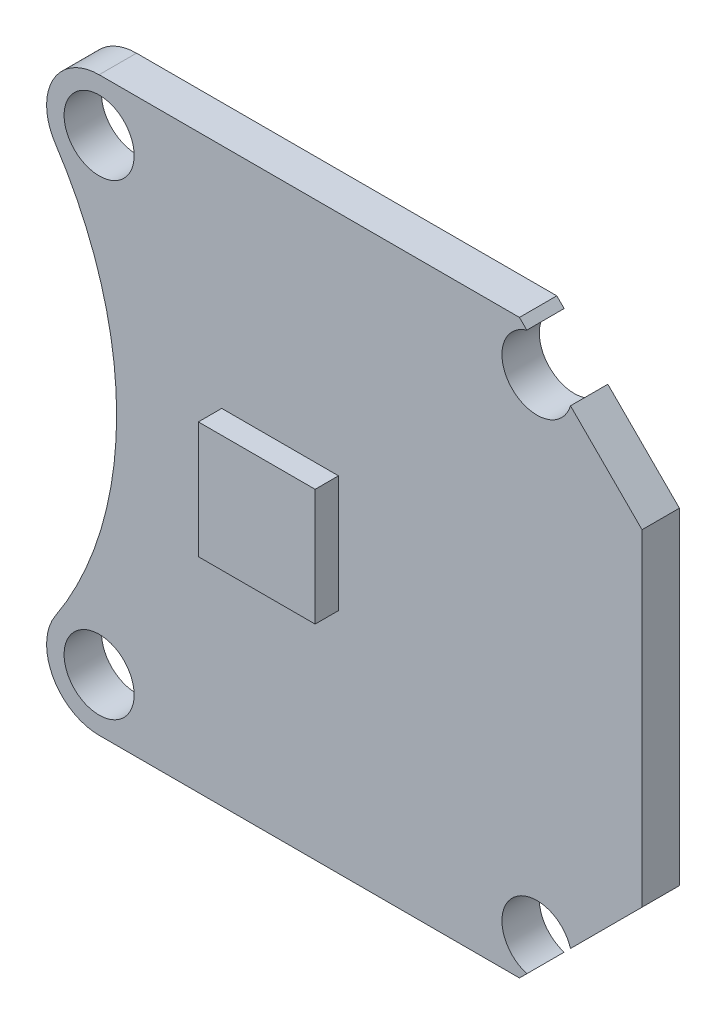
ISO-10303-21;
HEADER;
FILE_DESCRIPTION(('STEP AP214'),'2;1');
FILE_NAME('part.step','',(''),(''),'','','');
FILE_SCHEMA(('AUTOMOTIVE_DESIGN { 1 0 10303 214 1 1 1 1 }'));
ENDSEC;
DATA;
#1=APPLICATION_CONTEXT('core data for automotive mechanical design processes');
#2=APPLICATION_PROTOCOL_DEFINITION('international standard','automotive_design',2000,#1);
#3=PRODUCT_CONTEXT('',#1,'mechanical');
#4=PRODUCT('Part','Part','',(#3));
#5=PRODUCT_RELATED_PRODUCT_CATEGORY('part','',(#4));
#6=PRODUCT_DEFINITION_FORMATION('','',#4);
#7=PRODUCT_DEFINITION_CONTEXT('part definition',#1,'design');
#8=PRODUCT_DEFINITION('design','',#6,#7);
#9=PRODUCT_DEFINITION_SHAPE('','',#8);
#10=(LENGTH_UNIT() NAMED_UNIT(*) SI_UNIT(.MILLI.,.METRE.));
#11=(NAMED_UNIT(*) PLANE_ANGLE_UNIT() SI_UNIT($,.RADIAN.));
#12=(NAMED_UNIT(*) SI_UNIT($,.STERADIAN.) SOLID_ANGLE_UNIT());
#13=UNCERTAINTY_MEASURE_WITH_UNIT(LENGTH_MEASURE(1.E-05),#10,'distance_accuracy_value','');
#14=(GEOMETRIC_REPRESENTATION_CONTEXT(3) GLOBAL_UNCERTAINTY_ASSIGNED_CONTEXT((#13)) GLOBAL_UNIT_ASSIGNED_CONTEXT((#10,
#11,#12)) REPRESENTATION_CONTEXT('',''));
#15=CARTESIAN_POINT('',(0.,0.,0.));
#16=DIRECTION('',(0.,0.,1.));
#17=DIRECTION('',(1.,0.,0.));
#18=AXIS2_PLACEMENT_3D('',#15,#16,#17);
#19=CARTESIAN_POINT('',(0.,0.,2.6));
#20=DIRECTION('',(0.,0.,-1.));
#21=DIRECTION('',(-1.,0.,0.));
#22=AXIS2_PLACEMENT_3D('',#19,#20,#21);
#23=PLANE('',#22);
#24=DIRECTION('',(1.,0.,0.));
#25=VECTOR('',#24,1.);
#26=CARTESIAN_POINT('',(-2.5,2.5,2.6));
#27=LINE('',#26,#25);
#28=CARTESIAN_POINT('',(2.5,2.5,2.6));
#29=VERTEX_POINT('',#28);
#30=CARTESIAN_POINT('',(-2.5,2.5,2.6));
#31=VERTEX_POINT('',#30);
#32=EDGE_CURVE('E353',#29,#31,#27,.F.);
#33=ORIENTED_EDGE('',*,*,#32,.T.);
#34=DIRECTION('',(0.,1.,0.));
#35=VECTOR('',#34,1.);
#36=CARTESIAN_POINT('',(-2.5,-2.5,2.6));
#37=LINE('',#36,#35);
#38=CARTESIAN_POINT('',(-2.5,-2.5,2.6));
#39=VERTEX_POINT('',#38);
#40=EDGE_CURVE('E356',#31,#39,#37,.F.);
#41=ORIENTED_EDGE('',*,*,#40,.T.);
#42=DIRECTION('',(-1.,0.,0.));
#43=VECTOR('',#42,1.);
#44=CARTESIAN_POINT('',(-2.5,-2.5,2.6));
#45=LINE('',#44,#43);
#46=CARTESIAN_POINT('',(2.5,-2.5,2.6));
#47=VERTEX_POINT('',#46);
#48=EDGE_CURVE('E338',#39,#47,#45,.F.);
#49=ORIENTED_EDGE('',*,*,#48,.T.);
#50=DIRECTION('',(0.,-1.,0.));
#51=VECTOR('',#50,1.);
#52=CARTESIAN_POINT('',(2.5,-2.5,2.6));
#53=LINE('',#52,#51);
#54=EDGE_CURVE('E347',#47,#29,#53,.F.);
#55=ORIENTED_EDGE('',*,*,#54,.T.);
#56=EDGE_LOOP('',(#33,#41,#49,#55));
#57=FACE_BOUND('',#56,.T.);
#58=ADVANCED_FACE('F16',(#57),#23,.F.);
#59=CARTESIAN_POINT('',(-2.5,-2.5,2.6));
#60=DIRECTION('',(1.,0.,0.));
#61=DIRECTION('',(0.,1.,0.));
#62=AXIS2_PLACEMENT_3D('',#59,#60,#61);
#63=PLANE('',#62);
#64=DIRECTION('',(0.,0.,1.));
#65=VECTOR('',#64,1.);
#66=CARTESIAN_POINT('',(-2.5,-2.5,2.6));
#67=LINE('',#66,#65);
#68=CARTESIAN_POINT('',(-2.5,-2.5,1.6));
#69=VERTEX_POINT('',#68);
#70=EDGE_CURVE('E341',#69,#39,#67,.T.);
#71=ORIENTED_EDGE('',*,*,#70,.T.);
#72=ORIENTED_EDGE('',*,*,#40,.F.);
#73=DIRECTION('',(0.,0.,1.));
#74=VECTOR('',#73,1.);
#75=CARTESIAN_POINT('',(-2.5,2.5,2.6));
#76=LINE('',#75,#74);
#77=CARTESIAN_POINT('',(-2.5,2.5,1.6));
#78=VERTEX_POINT('',#77);
#79=EDGE_CURVE('E350',#31,#78,#76,.F.);
#80=ORIENTED_EDGE('',*,*,#79,.T.);
#81=DIRECTION('',(0.,1.,0.));
#82=VECTOR('',#81,1.);
#83=CARTESIAN_POINT('',(-2.5,0.,1.6));
#84=LINE('',#83,#82);
#85=EDGE_CURVE('E282',#69,#78,#84,.T.);
#86=ORIENTED_EDGE('',*,*,#85,.F.);
#87=EDGE_LOOP('',(#71,#72,#80,#86));
#88=FACE_BOUND('',#87,.T.);
#89=ADVANCED_FACE('F751',(#88),#63,.F.);
#90=CARTESIAN_POINT('',(-2.5,2.5,2.6));
#91=DIRECTION('',(0.,-1.,0.));
#92=DIRECTION('',(1.,0.,0.));
#93=AXIS2_PLACEMENT_3D('',#90,#91,#92);
#94=PLANE('',#93);
#95=ORIENTED_EDGE('',*,*,#79,.F.);
#96=ORIENTED_EDGE('',*,*,#32,.F.);
#97=DIRECTION('',(0.,0.,1.));
#98=VECTOR('',#97,1.);
#99=CARTESIAN_POINT('',(2.5,2.5,2.6));
#100=LINE('',#99,#98);
#101=CARTESIAN_POINT('',(2.5,2.5,1.6));
#102=VERTEX_POINT('',#101);
#103=EDGE_CURVE('E344',#29,#102,#100,.F.);
#104=ORIENTED_EDGE('',*,*,#103,.T.);
#105=DIRECTION('',(1.,0.,0.));
#106=VECTOR('',#105,1.);
#107=CARTESIAN_POINT('',(0.,2.5,1.6));
#108=LINE('',#107,#106);
#109=EDGE_CURVE('E280',#78,#102,#108,.T.);
#110=ORIENTED_EDGE('',*,*,#109,.F.);
#111=EDGE_LOOP('',(#95,#96,#104,#110));
#112=FACE_BOUND('',#111,.T.);
#113=ADVANCED_FACE('F742',(#112),#94,.F.);
#114=CARTESIAN_POINT('',(2.5,-2.5,2.6));
#115=DIRECTION('',(-1.,0.,0.));
#116=DIRECTION('',(0.,-1.,0.));
#117=AXIS2_PLACEMENT_3D('',#114,#115,#116);
#118=PLANE('',#117);
#119=ORIENTED_EDGE('',*,*,#103,.F.);
#120=ORIENTED_EDGE('',*,*,#54,.F.);
#121=DIRECTION('',(0.,0.,1.));
#122=VECTOR('',#121,1.);
#123=CARTESIAN_POINT('',(2.5,-2.5,2.6));
#124=LINE('',#123,#122);
#125=CARTESIAN_POINT('',(2.5,-2.5,1.6));
#126=VERTEX_POINT('',#125);
#127=EDGE_CURVE('E287',#47,#126,#124,.F.);
#128=ORIENTED_EDGE('',*,*,#127,.T.);
#129=DIRECTION('',(0.,1.,0.));
#130=VECTOR('',#129,1.);
#131=CARTESIAN_POINT('',(2.5,0.,1.6));
#132=LINE('',#131,#130);
#133=EDGE_CURVE('E278',#102,#126,#132,.F.);
#134=ORIENTED_EDGE('',*,*,#133,.F.);
#135=EDGE_LOOP('',(#119,#120,#128,#134));
#136=FACE_BOUND('',#135,.T.);
#137=ADVANCED_FACE('F528',(#136),#118,.F.);
#138=CARTESIAN_POINT('',(-2.5,-2.5,2.6));
#139=DIRECTION('',(0.,1.,0.));
#140=DIRECTION('',(-1.,0.,0.));
#141=AXIS2_PLACEMENT_3D('',#138,#139,#140);
#142=PLANE('',#141);
#143=ORIENTED_EDGE('',*,*,#127,.F.);
#144=ORIENTED_EDGE('',*,*,#48,.F.);
#145=ORIENTED_EDGE('',*,*,#70,.F.);
#146=DIRECTION('',(1.,0.,0.));
#147=VECTOR('',#146,1.);
#148=CARTESIAN_POINT('',(0.,-2.5,1.6));
#149=LINE('',#148,#147);
#150=EDGE_CURVE('E275',#126,#69,#149,.F.);
#151=ORIENTED_EDGE('',*,*,#150,.F.);
#152=EDGE_LOOP('',(#143,#144,#145,#151));
#153=FACE_BOUND('',#152,.T.);
#154=ADVANCED_FACE('F520',(#153),#142,.F.);
#155=CARTESIAN_POINT('',(-0.125000000000004,-13.75,-1.5));
#156=DIRECTION('',(0.,1.,0.));
#157=DIRECTION('',(-1.,0.,0.));
#158=AXIS2_PLACEMENT_3D('',#155,#156,#157);
#159=PLANE('',#158);
#160=DIRECTION('',(0.,0.,1.));
#161=VECTOR('',#160,1.);
#162=CARTESIAN_POINT('',(-0.125000000000004,-13.75,-1.5));
#163=LINE('',#162,#161);
#164=CARTESIAN_POINT('',(-0.125000000000004,-13.75,0.));
#165=VERTEX_POINT('',#164);
#166=CARTESIAN_POINT('',(-0.125000000000004,-13.75,-1.5));
#167=VERTEX_POINT('',#166);
#168=EDGE_CURVE('E236',#165,#167,#163,.F.);
#169=ORIENTED_EDGE('',*,*,#168,.T.);
#170=DIRECTION('',(1.,0.,0.));
#171=VECTOR('',#170,1.);
#172=CARTESIAN_POINT('',(0.,-13.75,-1.5));
#173=LINE('',#172,#171);
#174=CARTESIAN_POINT('',(3.375,-13.75,-1.5));
#175=VERTEX_POINT('',#174);
#176=EDGE_CURVE('E225',#167,#175,#173,.T.);
#177=ORIENTED_EDGE('',*,*,#176,.T.);
#178=DIRECTION('',(0.,0.,1.));
#179=VECTOR('',#178,1.);
#180=CARTESIAN_POINT('',(3.375,-13.75,-1.5));
#181=LINE('',#180,#179);
#182=CARTESIAN_POINT('',(3.375,-13.75,0.));
#183=VERTEX_POINT('',#182);
#184=EDGE_CURVE('E305',#175,#183,#181,.T.);
#185=ORIENTED_EDGE('',*,*,#184,.T.);
#186=DIRECTION('',(1.,0.,0.));
#187=VECTOR('',#186,1.);
#188=CARTESIAN_POINT('',(0.,-13.75,0.));
#189=LINE('',#188,#187);
#190=EDGE_CURVE('E246',#165,#183,#189,.T.);
#191=ORIENTED_EDGE('',*,*,#190,.F.);
#192=EDGE_LOOP('',(#169,#177,#185,#191));
#193=FACE_BOUND('',#192,.T.);
#194=ADVANCED_FACE('F518',(#193),#159,.F.);
#195=CARTESIAN_POINT('',(11.25,11.25,-28.2897949798156));
#196=DIRECTION('',(0.707106781186549,0.707106781186546,0.));
#197=DIRECTION('',(-0.707106781186546,0.707106781186549,0.));
#198=AXIS2_PLACEMENT_3D('',#195,#196,#197);
#199=PLANE('',#198);
#200=DIRECTION('',(0.,0.,1.));
#201=VECTOR('',#200,1.);
#202=CARTESIAN_POINT('',(10.25,12.25,-28.2897949798156));
#203=LINE('',#202,#201);
#204=CARTESIAN_POINT('',(10.25,12.25,1.6));
#205=VERTEX_POINT('',#204);
#206=CARTESIAN_POINT('',(10.25,12.25,0.));
#207=VERTEX_POINT('',#206);
#208=EDGE_CURVE('E389',#205,#207,#203,.F.);
#209=ORIENTED_EDGE('',*,*,#208,.F.);
#210=DIRECTION('',(-0.707106781186546,0.707106781186549,0.));
#211=VECTOR('',#210,1.);
#212=CARTESIAN_POINT('',(11.25,11.25,1.60000000000001));
#213=LINE('',#212,#211);
#214=CARTESIAN_POINT('',(10.5645856533065,11.9354143466935,1.6));
#215=VERTEX_POINT('',#214);
#216=EDGE_CURVE('E284',#205,#215,#213,.F.);
#217=ORIENTED_EDGE('',*,*,#216,.T.);
#218=DIRECTION('',(0.,0.,1.));
#219=VECTOR('',#218,1.);
#220=CARTESIAN_POINT('',(10.5645856533065,11.9354143466935,1.6));
#221=LINE('',#220,#219);
#222=CARTESIAN_POINT('',(10.5645856533065,11.9354143466935,0.));
#223=VERTEX_POINT('',#222);
#224=EDGE_CURVE('E392',#215,#223,#221,.F.);
#225=ORIENTED_EDGE('',*,*,#224,.T.);
#226=DIRECTION('',(-0.707106781186546,0.707106781186549,0.));
#227=VECTOR('',#226,1.);
#228=CARTESIAN_POINT('',(11.25,11.25,0.));
#229=LINE('',#228,#227);
#230=EDGE_CURVE('E285',#223,#207,#229,.T.);
#231=ORIENTED_EDGE('',*,*,#230,.T.);
#232=EDGE_LOOP('',(#209,#217,#225,#231));
#233=FACE_BOUND('',#232,.T.);
#234=ADVANCED_FACE('F481',(#233),#199,.T.);
#235=CARTESIAN_POINT('',(0.,0.,1.6));
#236=DIRECTION('',(0.,0.,1.));
#237=DIRECTION('',(1.,0.,0.));
#238=AXIS2_PLACEMENT_3D('',#235,#236,#237);
#239=PLANE('',#238);
#240=CARTESIAN_POINT('',(-7.75,10.,1.6));
#241=DIRECTION('',(0.,0.,1.));
#242=DIRECTION('',(1.,0.,0.));
#243=AXIS2_PLACEMENT_3D('',#240,#241,#242);
#244=CIRCLE('',#243,2.25);
#245=CARTESIAN_POINT('',(-9.62844036697248,8.76146788990826,1.6));
#246=VERTEX_POINT('',#245);
#247=CARTESIAN_POINT('',(-7.75,12.25,1.6));
#248=VERTEX_POINT('',#247);
#249=EDGE_CURVE('E385',#246,#248,#244,.F.);
#250=ORIENTED_EDGE('',*,*,#249,.F.);
#251=CARTESIAN_POINT('',(-22.9166666666667,0.,1.6));
#252=DIRECTION('',(0.,0.,1.));
#253=DIRECTION('',(1.,0.,0.));
#254=AXIS2_PLACEMENT_3D('',#251,#252,#253);
#255=CIRCLE('',#254,15.9166666666667);
#256=CARTESIAN_POINT('',(-9.62844036697248,-8.76146788990826,1.6));
#257=VERTEX_POINT('',#256);
#258=EDGE_CURVE('E381',#246,#257,#255,.F.);
#259=ORIENTED_EDGE('',*,*,#258,.T.);
#260=CARTESIAN_POINT('',(-7.75,-10.,1.6));
#261=DIRECTION('',(0.,0.,1.));
#262=DIRECTION('',(1.,0.,0.));
#263=AXIS2_PLACEMENT_3D('',#260,#261,#262);
#264=CIRCLE('',#263,2.25);
#265=CARTESIAN_POINT('',(-7.75,-12.25,1.6));
#266=VERTEX_POINT('',#265);
#267=EDGE_CURVE('E378',#266,#257,#264,.F.);
#268=ORIENTED_EDGE('',*,*,#267,.F.);
#269=DIRECTION('',(-1.,0.,0.));
#270=VECTOR('',#269,1.);
#271=CARTESIAN_POINT('',(0.,-12.25,1.6));
#272=LINE('',#271,#270);
#273=CARTESIAN_POINT('',(10.25,-12.25,1.60000000000001));
#274=VERTEX_POINT('',#273);
#275=EDGE_CURVE('E327',#266,#274,#272,.F.);
#276=ORIENTED_EDGE('',*,*,#275,.T.);
#277=DIRECTION('',(-0.707106781186546,-0.707106781186549,0.));
#278=VECTOR('',#277,1.);
#279=CARTESIAN_POINT('',(11.25,-11.25,1.60000000000001));
#280=LINE('',#279,#278);
#281=CARTESIAN_POINT('',(10.5645856533065,-11.9354143466935,1.6));
#282=VERTEX_POINT('',#281);
#283=EDGE_CURVE('E174',#274,#282,#280,.F.);
#284=ORIENTED_EDGE('',*,*,#283,.T.);
#285=CARTESIAN_POINT('',(11.,-10.5,1.6));
#286=DIRECTION('',(0.,0.,1.));
#287=DIRECTION('',(1.,0.,0.));
#288=AXIS2_PLACEMENT_3D('',#285,#286,#287);
#289=CIRCLE('',#288,1.5);
#290=CARTESIAN_POINT('',(12.4354143466935,-10.0645856533065,1.6));
#291=VERTEX_POINT('',#290);
#292=EDGE_CURVE('E190',#282,#291,#289,.F.);
#293=ORIENTED_EDGE('',*,*,#292,.T.);
#294=DIRECTION('',(-0.707106781186546,-0.707106781186549,0.));
#295=VECTOR('',#294,1.);
#296=CARTESIAN_POINT('',(11.25,-11.25,1.60000000000001));
#297=LINE('',#296,#295);
#298=CARTESIAN_POINT('',(15.5,-7.,1.6));
#299=VERTEX_POINT('',#298);
#300=EDGE_CURVE('E180',#291,#299,#297,.F.);
#301=ORIENTED_EDGE('',*,*,#300,.T.);
#302=DIRECTION('',(0.,1.,0.));
#303=VECTOR('',#302,1.);
#304=CARTESIAN_POINT('',(15.5,-7.,1.6));
#305=LINE('',#304,#303);
#306=CARTESIAN_POINT('',(15.5,7.00000000000001,1.60000000000001));
#307=VERTEX_POINT('',#306);
#308=EDGE_CURVE('E188',#307,#299,#305,.F.);
#309=ORIENTED_EDGE('',*,*,#308,.F.);
#310=DIRECTION('',(-0.707106781186546,0.707106781186549,0.));
#311=VECTOR('',#310,1.);
#312=CARTESIAN_POINT('',(11.25,11.25,1.60000000000001));
#313=LINE('',#312,#311);
#314=CARTESIAN_POINT('',(12.4354143466935,10.0645856533065,1.6));
#315=VERTEX_POINT('',#314);
#316=EDGE_CURVE('E296',#315,#307,#313,.F.);
#317=ORIENTED_EDGE('',*,*,#316,.F.);
#318=CARTESIAN_POINT('',(11.,10.5,1.6));
#319=DIRECTION('',(0.,0.,1.));
#320=DIRECTION('',(1.,0.,0.));
#321=AXIS2_PLACEMENT_3D('',#318,#319,#320);
#322=CIRCLE('',#321,1.5);
#323=EDGE_CURVE('E390',#315,#215,#322,.F.);
#324=ORIENTED_EDGE('',*,*,#323,.T.);
#325=ORIENTED_EDGE('',*,*,#216,.F.);
#326=DIRECTION('',(-1.,0.,0.));
#327=VECTOR('',#326,1.);
#328=CARTESIAN_POINT('',(0.,12.25,1.6));
#329=LINE('',#328,#327);
#330=EDGE_CURVE('E401',#248,#205,#329,.F.);
#331=ORIENTED_EDGE('',*,*,#330,.F.);
#332=EDGE_LOOP('',(#250,#259,#268,#276,#284,#293,#301,#309,#317,#324,#325,#331));
#333=FACE_BOUND('',#332,.T.);
#334=CARTESIAN_POINT('',(-7.75,10.,1.6));
#335=DIRECTION('',(0.,0.,1.));
#336=DIRECTION('',(1.,0.,0.));
#337=AXIS2_PLACEMENT_3D('',#334,#335,#336);
#338=CIRCLE('',#337,1.5);
#339=CARTESIAN_POINT('',(-6.25,10.,1.6));
#340=VERTEX_POINT('',#339);
#341=EDGE_CURVE('E261',#340,#340,#338,.F.);
#342=ORIENTED_EDGE('',*,*,#341,.T.);
#343=EDGE_LOOP('',(#342));
#344=FACE_BOUND('',#343,.T.);
#345=CARTESIAN_POINT('',(-7.75,-10.,1.6));
#346=DIRECTION('',(0.,0.,1.));
#347=DIRECTION('',(1.,0.,0.));
#348=AXIS2_PLACEMENT_3D('',#345,#346,#347);
#349=CIRCLE('',#348,1.5);
#350=CARTESIAN_POINT('',(-6.25,-10.,1.6));
#351=VERTEX_POINT('',#350);
#352=EDGE_CURVE('E209',#351,#351,#349,.F.);
#353=ORIENTED_EDGE('',*,*,#352,.T.);
#354=EDGE_LOOP('',(#353));
#355=FACE_BOUND('',#354,.T.);
#356=ORIENTED_EDGE('',*,*,#133,.T.);
#357=ORIENTED_EDGE('',*,*,#150,.T.);
#358=ORIENTED_EDGE('',*,*,#85,.T.);
#359=ORIENTED_EDGE('',*,*,#109,.T.);
#360=EDGE_LOOP('',(#356,#357,#358,#359));
#361=FACE_BOUND('',#360,.T.);
#362=ADVANCED_FACE('F192',(#333,#344,#355,#361),#239,.T.);
#363=CARTESIAN_POINT('',(11.25,-11.25,-28.2897949798156));
#364=DIRECTION('',(-0.707106781186549,0.707106781186546,0.));
#365=DIRECTION('',(-0.707106781186546,-0.707106781186549,0.));
#366=AXIS2_PLACEMENT_3D('',#363,#364,#365);
#367=PLANE('',#366);
#368=DIRECTION('',(0.,0.,1.));
#369=VECTOR('',#368,1.);
#370=CARTESIAN_POINT('',(10.5645856533065,-11.9354143466935,1.6));
#371=LINE('',#370,#369);
#372=CARTESIAN_POINT('',(10.5645856533065,-11.9354143466935,0.));
#373=VERTEX_POINT('',#372);
#374=EDGE_CURVE('E197',#373,#282,#371,.T.);
#375=ORIENTED_EDGE('',*,*,#374,.T.);
#376=ORIENTED_EDGE('',*,*,#283,.F.);
#377=DIRECTION('',(0.,0.,1.));
#378=VECTOR('',#377,1.);
#379=CARTESIAN_POINT('',(10.25,-12.25,-28.2897949798156));
#380=LINE('',#379,#378);
#381=CARTESIAN_POINT('',(10.25,-12.25,0.));
#382=VERTEX_POINT('',#381);
#383=EDGE_CURVE('E256',#274,#382,#380,.F.);
#384=ORIENTED_EDGE('',*,*,#383,.T.);
#385=DIRECTION('',(-0.707106781186546,-0.707106781186549,0.));
#386=VECTOR('',#385,1.);
#387=CARTESIAN_POINT('',(11.25,-11.25,0.));
#388=LINE('',#387,#386);
#389=EDGE_CURVE('E303',#373,#382,#388,.T.);
#390=ORIENTED_EDGE('',*,*,#389,.F.);
#391=EDGE_LOOP('',(#375,#376,#384,#390));
#392=FACE_BOUND('',#391,.T.);
#393=ADVANCED_FACE('F579',(#392),#367,.F.);
#394=CARTESIAN_POINT('',(3.375,-13.75,-1.5));
#395=DIRECTION('',(-1.,0.,0.));
#396=DIRECTION('',(0.,-1.,0.));
#397=AXIS2_PLACEMENT_3D('',#394,#395,#396);
#398=PLANE('',#397);
#399=ORIENTED_EDGE('',*,*,#184,.F.);
#400=DIRECTION('',(0.,1.,0.));
#401=VECTOR('',#400,1.);
#402=CARTESIAN_POINT('',(3.375,0.,-1.5));
#403=LINE('',#402,#401);
#404=CARTESIAN_POINT('',(3.375,-12.25,-1.5));
#405=VERTEX_POINT('',#404);
#406=EDGE_CURVE('E259',#175,#405,#403,.T.);
#407=ORIENTED_EDGE('',*,*,#406,.T.);
#408=DIRECTION('',(0.,0.,1.));
#409=VECTOR('',#408,1.);
#410=CARTESIAN_POINT('',(3.375,-12.25,-28.2897949798156));
#411=LINE('',#410,#409);
#412=CARTESIAN_POINT('',(3.375,-12.25,0.));
#413=VERTEX_POINT('',#412);
#414=EDGE_CURVE('E241',#405,#413,#411,.T.);
#415=ORIENTED_EDGE('',*,*,#414,.T.);
#416=DIRECTION('',(0.,1.,0.));
#417=VECTOR('',#416,1.);
#418=CARTESIAN_POINT('',(3.375,0.,0.));
#419=LINE('',#418,#417);
#420=EDGE_CURVE('E244',#183,#413,#419,.T.);
#421=ORIENTED_EDGE('',*,*,#420,.F.);
#422=EDGE_LOOP('',(#399,#407,#415,#421));
#423=FACE_BOUND('',#422,.T.);
#424=ADVANCED_FACE('F513',(#423),#398,.F.);
#425=CARTESIAN_POINT('',(0.,0.,0.));
#426=DIRECTION('',(0.,0.,1.));
#427=DIRECTION('',(1.,0.,0.));
#428=AXIS2_PLACEMENT_3D('',#425,#426,#427);
#429=PLANE('',#428);
#430=ORIENTED_EDGE('',*,*,#190,.T.);
#431=ORIENTED_EDGE('',*,*,#420,.T.);
#432=DIRECTION('',(-1.,0.,0.));
#433=VECTOR('',#432,1.);
#434=CARTESIAN_POINT('',(0.,-12.25,0.));
#435=LINE('',#434,#433);
#436=CARTESIAN_POINT('',(-0.125000000000004,-12.25,0.));
#437=VERTEX_POINT('',#436);
#438=EDGE_CURVE('E231',#413,#437,#435,.T.);
#439=ORIENTED_EDGE('',*,*,#438,.T.);
#440=DIRECTION('',(0.,1.,0.));
#441=VECTOR('',#440,1.);
#442=CARTESIAN_POINT('',(-0.125000000000004,-12.25,0.));
#443=LINE('',#442,#441);
#444=EDGE_CURVE('E226',#437,#165,#443,.F.);
#445=ORIENTED_EDGE('',*,*,#444,.T.);
#446=EDGE_LOOP('',(#430,#431,#439,#445));
#447=FACE_BOUND('',#446,.T.);
#448=ADVANCED_FACE('F509',(#447),#429,.T.);
#449=CARTESIAN_POINT('',(-0.125000000000004,-12.25,-1.5));
#450=DIRECTION('',(1.,0.,0.));
#451=DIRECTION('',(0.,1.,0.));
#452=AXIS2_PLACEMENT_3D('',#449,#450,#451);
#453=PLANE('',#452);
#454=DIRECTION('',(0.,0.,1.));
#455=VECTOR('',#454,1.);
#456=CARTESIAN_POINT('',(-0.125000000000004,-12.25,-28.2897949798156));
#457=LINE('',#456,#455);
#458=CARTESIAN_POINT('',(-0.125000000000004,-12.25,-1.5));
#459=VERTEX_POINT('',#458);
#460=EDGE_CURVE('E213',#437,#459,#457,.F.);
#461=ORIENTED_EDGE('',*,*,#460,.T.);
#462=DIRECTION('',(0.,1.,0.));
#463=VECTOR('',#462,1.);
#464=CARTESIAN_POINT('',(-0.125000000000004,0.,-1.5));
#465=LINE('',#464,#463);
#466=EDGE_CURVE('E222',#459,#167,#465,.F.);
#467=ORIENTED_EDGE('',*,*,#466,.T.);
#468=ORIENTED_EDGE('',*,*,#168,.F.);
#469=ORIENTED_EDGE('',*,*,#444,.F.);
#470=EDGE_LOOP('',(#461,#467,#468,#469));
#471=FACE_BOUND('',#470,.T.);
#472=ADVANCED_FACE('F506',(#471),#453,.F.);
#473=CARTESIAN_POINT('',(0.,0.,-1.5));
#474=DIRECTION('',(0.,0.,1.));
#475=DIRECTION('',(1.,0.,0.));
#476=AXIS2_PLACEMENT_3D('',#473,#474,#475);
#477=PLANE('',#476);
#478=DIRECTION('',(-1.,0.,0.));
#479=VECTOR('',#478,1.);
#480=CARTESIAN_POINT('',(0.,-12.25,-1.5));
#481=LINE('',#480,#479);
#482=CARTESIAN_POINT('',(5.,-12.25,-1.5));
#483=VERTEX_POINT('',#482);
#484=EDGE_CURVE('E251',#483,#405,#481,.T.);
#485=ORIENTED_EDGE('',*,*,#484,.T.);
#486=ORIENTED_EDGE('',*,*,#406,.F.);
#487=ORIENTED_EDGE('',*,*,#176,.F.);
#488=ORIENTED_EDGE('',*,*,#466,.F.);
#489=DIRECTION('',(-1.,0.,0.));
#490=VECTOR('',#489,1.);
#491=CARTESIAN_POINT('',(0.,-12.25,-1.5));
#492=LINE('',#491,#490);
#493=CARTESIAN_POINT('',(-1.75,-12.25,-1.5));
#494=VERTEX_POINT('',#493);
#495=EDGE_CURVE('E210',#459,#494,#492,.T.);
#496=ORIENTED_EDGE('',*,*,#495,.T.);
#497=DIRECTION('',(0.,1.,0.));
#498=VECTOR('',#497,1.);
#499=CARTESIAN_POINT('',(-1.75,-12.25,-1.5));
#500=LINE('',#499,#498);
#501=CARTESIAN_POINT('',(-1.75,-9.25,-1.5));
#502=VERTEX_POINT('',#501);
#503=EDGE_CURVE('E216',#494,#502,#500,.T.);
#504=ORIENTED_EDGE('',*,*,#503,.T.);
#505=DIRECTION('',(1.,0.,0.));
#506=VECTOR('',#505,1.);
#507=CARTESIAN_POINT('',(5.,-9.25,-1.5));
#508=LINE('',#507,#506);
#509=CARTESIAN_POINT('',(5.,-9.25,-1.5));
#510=VERTEX_POINT('',#509);
#511=EDGE_CURVE('E442',#502,#510,#508,.T.);
#512=ORIENTED_EDGE('',*,*,#511,.T.);
#513=DIRECTION('',(0.,-1.,0.));
#514=VECTOR('',#513,1.);
#515=CARTESIAN_POINT('',(5.,-12.25,-1.5));
#516=LINE('',#515,#514);
#517=EDGE_CURVE('E268',#510,#483,#516,.T.);
#518=ORIENTED_EDGE('',*,*,#517,.T.);
#519=EDGE_LOOP('',(#485,#486,#487,#488,#496,#504,#512,#518));
#520=FACE_BOUND('',#519,.T.);
#521=ADVANCED_FACE('F516',(#520),#477,.F.);
#522=CARTESIAN_POINT('',(-7.75,10.,1.6));
#523=DIRECTION('',(0.,0.,1.));
#524=DIRECTION('',(1.,0.,0.));
#525=AXIS2_PLACEMENT_3D('',#522,#523,#524);
#526=CYLINDRICAL_SURFACE('',#525,1.5);
#527=CARTESIAN_POINT('',(-7.75,10.,0.));
#528=DIRECTION('',(0.,0.,1.));
#529=DIRECTION('',(1.,0.,0.));
#530=AXIS2_PLACEMENT_3D('',#527,#528,#529);
#531=CIRCLE('',#530,1.5);
#532=CARTESIAN_POINT('',(-6.25,10.,0.));
#533=VERTEX_POINT('',#532);
#534=EDGE_CURVE('E267',#533,#533,#531,.F.);
#535=ORIENTED_EDGE('',*,*,#534,.T.);
#536=EDGE_LOOP('',(#535));
#537=FACE_BOUND('',#536,.T.);
#538=ORIENTED_EDGE('',*,*,#341,.F.);
#539=EDGE_LOOP('',(#538));
#540=FACE_BOUND('',#539,.T.);
#541=ADVANCED_FACE('F566',(#537,#540),#526,.F.);
#542=CARTESIAN_POINT('',(-7.75,-10.,1.6));
#543=DIRECTION('',(0.,0.,1.));
#544=DIRECTION('',(1.,0.,0.));
#545=AXIS2_PLACEMENT_3D('',#542,#543,#544);
#546=CYLINDRICAL_SURFACE('',#545,1.5);
#547=CARTESIAN_POINT('',(-7.75,-10.,0.));
#548=DIRECTION('',(0.,0.,1.));
#549=DIRECTION('',(1.,0.,0.));
#550=AXIS2_PLACEMENT_3D('',#547,#548,#549);
#551=CIRCLE('',#550,1.5);
#552=CARTESIAN_POINT('',(-6.25,-10.,0.));
#553=VERTEX_POINT('',#552);
#554=EDGE_CURVE('E333',#553,#553,#551,.F.);
#555=ORIENTED_EDGE('',*,*,#554,.T.);
#556=EDGE_LOOP('',(#555));
#557=FACE_BOUND('',#556,.T.);
#558=ORIENTED_EDGE('',*,*,#352,.F.);
#559=EDGE_LOOP('',(#558));
#560=FACE_BOUND('',#559,.T.);
#561=ADVANCED_FACE('F563',(#557,#560),#546,.F.);
#562=CARTESIAN_POINT('',(11.,-10.5,1.6));
#563=DIRECTION('',(0.,0.,1.));
#564=DIRECTION('',(1.,0.,0.));
#565=AXIS2_PLACEMENT_3D('',#562,#563,#564);
#566=CYLINDRICAL_SURFACE('',#565,1.5);
#567=DIRECTION('',(0.,0.,1.));
#568=VECTOR('',#567,1.);
#569=CARTESIAN_POINT('',(12.4354143466935,-10.0645856533065,-28.2897949798156));
#570=LINE('',#569,#568);
#571=CARTESIAN_POINT('',(12.4354143466935,-10.0645856533065,0.));
#572=VERTEX_POINT('',#571);
#573=EDGE_CURVE('E184',#572,#291,#570,.T.);
#574=ORIENTED_EDGE('',*,*,#573,.T.);
#575=ORIENTED_EDGE('',*,*,#292,.F.);
#576=ORIENTED_EDGE('',*,*,#374,.F.);
#577=CARTESIAN_POINT('',(11.,-10.5,0.));
#578=DIRECTION('',(0.,0.,1.));
#579=DIRECTION('',(1.,0.,0.));
#580=AXIS2_PLACEMENT_3D('',#577,#578,#579);
#581=CIRCLE('',#580,1.5);
#582=EDGE_CURVE('E202',#373,#572,#581,.F.);
#583=ORIENTED_EDGE('',*,*,#582,.T.);
#584=EDGE_LOOP('',(#574,#575,#576,#583));
#585=FACE_BOUND('',#584,.T.);
#586=ADVANCED_FACE('F200',(#585),#566,.F.);
#587=CARTESIAN_POINT('',(11.25,-11.25,-28.2897949798156));
#588=DIRECTION('',(-0.707106781186549,0.707106781186546,0.));
#589=DIRECTION('',(-0.707106781186546,-0.707106781186549,0.));
#590=AXIS2_PLACEMENT_3D('',#587,#588,#589);
#591=PLANE('',#590);
#592=ORIENTED_EDGE('',*,*,#300,.F.);
#593=ORIENTED_EDGE('',*,*,#573,.F.);
#594=DIRECTION('',(0.707106781186546,0.707106781186549,0.));
#595=VECTOR('',#594,1.);
#596=CARTESIAN_POINT('',(12.4354143466935,-10.0645856533065,0.));
#597=LINE('',#596,#595);
#598=CARTESIAN_POINT('',(15.5,-7.,0.));
#599=VERTEX_POINT('',#598);
#600=EDGE_CURVE('E373',#572,#599,#597,.T.);
#601=ORIENTED_EDGE('',*,*,#600,.T.);
#602=DIRECTION('',(0.,0.,1.));
#603=VECTOR('',#602,1.);
#604=CARTESIAN_POINT('',(15.5,-7.,22.4865985742054));
#605=LINE('',#604,#603);
#606=EDGE_CURVE('E186',#299,#599,#605,.F.);
#607=ORIENTED_EDGE('',*,*,#606,.F.);
#608=EDGE_LOOP('',(#592,#593,#601,#607));
#609=FACE_BOUND('',#608,.T.);
#610=ADVANCED_FACE('F181',(#609),#591,.F.);
#611=CARTESIAN_POINT('',(15.5,-7.,22.4865985742054));
#612=DIRECTION('',(1.,0.,0.));
#613=DIRECTION('',(0.,1.,0.));
#614=AXIS2_PLACEMENT_3D('',#611,#612,#613);
#615=PLANE('',#614);
#616=ORIENTED_EDGE('',*,*,#606,.T.);
#617=DIRECTION('',(0.,1.,0.));
#618=VECTOR('',#617,1.);
#619=CARTESIAN_POINT('',(15.5,0.,0.));
#620=LINE('',#619,#618);
#621=CARTESIAN_POINT('',(15.5,7.,0.));
#622=VERTEX_POINT('',#621);
#623=EDGE_CURVE('E419',#599,#622,#620,.T.);
#624=ORIENTED_EDGE('',*,*,#623,.T.);
#625=DIRECTION('',(0.,0.,1.));
#626=VECTOR('',#625,1.);
#627=CARTESIAN_POINT('',(15.5,7.00000000000001,-28.2897949798156));
#628=LINE('',#627,#626);
#629=EDGE_CURVE('E298',#307,#622,#628,.F.);
#630=ORIENTED_EDGE('',*,*,#629,.F.);
#631=ORIENTED_EDGE('',*,*,#308,.T.);
#632=EDGE_LOOP('',(#616,#624,#630,#631));
#633=FACE_BOUND('',#632,.T.);
#634=ADVANCED_FACE('F425',(#633),#615,.T.);
#635=CARTESIAN_POINT('',(11.25,11.25,-28.2897949798156));
#636=DIRECTION('',(0.707106781186549,0.707106781186546,0.));
#637=DIRECTION('',(-0.707106781186546,0.707106781186549,0.));
#638=AXIS2_PLACEMENT_3D('',#635,#636,#637);
#639=PLANE('',#638);
#640=ORIENTED_EDGE('',*,*,#629,.T.);
#641=DIRECTION('',(-0.707106781186547,0.707106781186549,0.));
#642=VECTOR('',#641,1.);
#643=CARTESIAN_POINT('',(15.5,7.,0.));
#644=LINE('',#643,#642);
#645=CARTESIAN_POINT('',(12.4354143466935,10.0645856533065,0.));
#646=VERTEX_POINT('',#645);
#647=EDGE_CURVE('E371',#622,#646,#644,.T.);
#648=ORIENTED_EDGE('',*,*,#647,.T.);
#649=DIRECTION('',(0.,0.,1.));
#650=VECTOR('',#649,1.);
#651=CARTESIAN_POINT('',(12.4354143466935,10.0645856533065,1.6));
#652=LINE('',#651,#650);
#653=EDGE_CURVE('E393',#646,#315,#652,.T.);
#654=ORIENTED_EDGE('',*,*,#653,.T.);
#655=ORIENTED_EDGE('',*,*,#316,.T.);
#656=EDGE_LOOP('',(#640,#648,#654,#655));
#657=FACE_BOUND('',#656,.T.);
#658=ADVANCED_FACE('F477',(#657),#639,.T.);
#659=CARTESIAN_POINT('',(11.,10.5,1.6));
#660=DIRECTION('',(0.,0.,1.));
#661=DIRECTION('',(1.,0.,0.));
#662=AXIS2_PLACEMENT_3D('',#659,#660,#661);
#663=CYLINDRICAL_SURFACE('',#662,1.5);
#664=ORIENTED_EDGE('',*,*,#323,.F.);
#665=ORIENTED_EDGE('',*,*,#653,.F.);
#666=CARTESIAN_POINT('',(11.,10.5,0.));
#667=DIRECTION('',(0.,0.,1.));
#668=DIRECTION('',(1.,0.,0.));
#669=AXIS2_PLACEMENT_3D('',#666,#667,#668);
#670=CIRCLE('',#669,1.5);
#671=EDGE_CURVE('E368',#646,#223,#670,.F.);
#672=ORIENTED_EDGE('',*,*,#671,.T.);
#673=ORIENTED_EDGE('',*,*,#224,.F.);
#674=EDGE_LOOP('',(#664,#665,#672,#673));
#675=FACE_BOUND('',#674,.T.);
#676=ADVANCED_FACE('F480',(#675),#663,.F.);
#677=CARTESIAN_POINT('',(0.,12.25,-28.2897949798156));
#678=DIRECTION('',(0.,1.,0.));
#679=DIRECTION('',(-1.,0.,0.));
#680=AXIS2_PLACEMENT_3D('',#677,#678,#679);
#681=PLANE('',#680);
#682=ORIENTED_EDGE('',*,*,#330,.T.);
#683=ORIENTED_EDGE('',*,*,#208,.T.);
#684=DIRECTION('',(1.,0.,0.));
#685=VECTOR('',#684,1.);
#686=CARTESIAN_POINT('',(0.,12.25,0.));
#687=LINE('',#686,#685);
#688=CARTESIAN_POINT('',(-7.75,12.25,0.));
#689=VERTEX_POINT('',#688);
#690=EDGE_CURVE('E367',#207,#689,#687,.F.);
#691=ORIENTED_EDGE('',*,*,#690,.T.);
#692=DIRECTION('',(0.,0.,1.));
#693=VECTOR('',#692,1.);
#694=CARTESIAN_POINT('',(-7.75,12.25,-28.2897949798156));
#695=LINE('',#694,#693);
#696=EDGE_CURVE('E388',#248,#689,#695,.F.);
#697=ORIENTED_EDGE('',*,*,#696,.F.);
#698=EDGE_LOOP('',(#682,#683,#691,#697));
#699=FACE_BOUND('',#698,.T.);
#700=ADVANCED_FACE('F468',(#699),#681,.T.);
#701=CARTESIAN_POINT('',(-7.75,10.,-28.2897949798156));
#702=DIRECTION('',(0.,0.,1.));
#703=DIRECTION('',(1.,0.,0.));
#704=AXIS2_PLACEMENT_3D('',#701,#702,#703);
#705=CYLINDRICAL_SURFACE('',#704,2.25);
#706=ORIENTED_EDGE('',*,*,#249,.T.);
#707=ORIENTED_EDGE('',*,*,#696,.T.);
#708=CARTESIAN_POINT('',(-7.75,10.,0.));
#709=DIRECTION('',(0.,0.,1.));
#710=DIRECTION('',(1.,0.,0.));
#711=AXIS2_PLACEMENT_3D('',#708,#709,#710);
#712=CIRCLE('',#711,2.25);
#713=CARTESIAN_POINT('',(-9.62844036697248,8.76146788990826,0.));
#714=VERTEX_POINT('',#713);
#715=EDGE_CURVE('E364',#689,#714,#712,.T.);
#716=ORIENTED_EDGE('',*,*,#715,.T.);
#717=DIRECTION('',(0.,0.,1.));
#718=VECTOR('',#717,1.);
#719=CARTESIAN_POINT('',(-9.62844036697248,8.76146788990826,-28.2897949798156));
#720=LINE('',#719,#718);
#721=EDGE_CURVE('E384',#714,#246,#720,.T.);
#722=ORIENTED_EDGE('',*,*,#721,.T.);
#723=EDGE_LOOP('',(#706,#707,#716,#722));
#724=FACE_BOUND('',#723,.T.);
#725=ADVANCED_FACE('F463',(#724),#705,.T.);
#726=CARTESIAN_POINT('',(-22.9166666666667,0.,-28.2897949798156));
#727=DIRECTION('',(0.,0.,1.));
#728=DIRECTION('',(1.,0.,0.));
#729=AXIS2_PLACEMENT_3D('',#726,#727,#728);
#730=CYLINDRICAL_SURFACE('',#729,15.9166666666667);
#731=CARTESIAN_POINT('',(-22.9166666666667,0.,0.));
#732=DIRECTION('',(0.,0.,1.));
#733=DIRECTION('',(1.,0.,0.));
#734=AXIS2_PLACEMENT_3D('',#731,#732,#733);
#735=CIRCLE('',#734,15.9166666666667);
#736=CARTESIAN_POINT('',(-9.62844036697248,-8.76146788990826,0.));
#737=VERTEX_POINT('',#736);
#738=EDGE_CURVE('E362',#714,#737,#735,.F.);
#739=ORIENTED_EDGE('',*,*,#738,.T.);
#740=DIRECTION('',(0.,0.,1.));
#741=VECTOR('',#740,1.);
#742=CARTESIAN_POINT('',(-9.62844036697248,-8.76146788990826,-28.2897949798156));
#743=LINE('',#742,#741);
#744=EDGE_CURVE('E380',#257,#737,#743,.F.);
#745=ORIENTED_EDGE('',*,*,#744,.F.);
#746=ORIENTED_EDGE('',*,*,#258,.F.);
#747=ORIENTED_EDGE('',*,*,#721,.F.);
#748=EDGE_LOOP('',(#739,#745,#746,#747));
#749=FACE_BOUND('',#748,.T.);
#750=ADVANCED_FACE('F485',(#749),#730,.F.);
#751=CARTESIAN_POINT('',(-7.75,-10.,-28.2897949798156));
#752=DIRECTION('',(0.,0.,1.));
#753=DIRECTION('',(1.,0.,0.));
#754=AXIS2_PLACEMENT_3D('',#751,#752,#753);
#755=CYLINDRICAL_SURFACE('',#754,2.25);
#756=ORIENTED_EDGE('',*,*,#267,.T.);
#757=ORIENTED_EDGE('',*,*,#744,.T.);
#758=CARTESIAN_POINT('',(-7.75,-10.,0.));
#759=DIRECTION('',(0.,0.,1.));
#760=DIRECTION('',(1.,0.,0.));
#761=AXIS2_PLACEMENT_3D('',#758,#759,#760);
#762=CIRCLE('',#761,2.25);
#763=CARTESIAN_POINT('',(-7.75,-12.25,0.));
#764=VERTEX_POINT('',#763);
#765=EDGE_CURVE('E358',#737,#764,#762,.T.);
#766=ORIENTED_EDGE('',*,*,#765,.T.);
#767=DIRECTION('',(0.,0.,1.));
#768=VECTOR('',#767,1.);
#769=CARTESIAN_POINT('',(-7.75,-12.25,-28.2897949798156));
#770=LINE('',#769,#768);
#771=EDGE_CURVE('E212',#764,#266,#770,.T.);
#772=ORIENTED_EDGE('',*,*,#771,.T.);
#773=EDGE_LOOP('',(#756,#757,#766,#772));
#774=FACE_BOUND('',#773,.T.);
#775=ADVANCED_FACE('F487',(#774),#755,.T.);
#776=CARTESIAN_POINT('',(0.,-12.25,-28.2897949798156));
#777=DIRECTION('',(0.,1.,0.));
#778=DIRECTION('',(-1.,0.,0.));
#779=AXIS2_PLACEMENT_3D('',#776,#777,#778);
#780=PLANE('',#779);
#781=DIRECTION('',(1.,0.,0.));
#782=VECTOR('',#781,1.);
#783=CARTESIAN_POINT('',(0.,-12.25,0.));
#784=LINE('',#783,#782);
#785=CARTESIAN_POINT('',(-1.75,-12.25,0.));
#786=VERTEX_POINT('',#785);
#787=EDGE_CURVE('E361',#764,#786,#784,.T.);
#788=ORIENTED_EDGE('',*,*,#787,.T.);
#789=DIRECTION('',(0.,0.,1.));
#790=VECTOR('',#789,1.);
#791=CARTESIAN_POINT('',(-1.75,-12.25,-1.5));
#792=LINE('',#791,#790);
#793=EDGE_CURVE('E219',#786,#494,#792,.F.);
#794=ORIENTED_EDGE('',*,*,#793,.T.);
#795=ORIENTED_EDGE('',*,*,#495,.F.);
#796=ORIENTED_EDGE('',*,*,#460,.F.);
#797=ORIENTED_EDGE('',*,*,#438,.F.);
#798=ORIENTED_EDGE('',*,*,#414,.F.);
#799=ORIENTED_EDGE('',*,*,#484,.F.);
#800=DIRECTION('',(0.,0.,1.));
#801=VECTOR('',#800,1.);
#802=CARTESIAN_POINT('',(5.,-12.25,-1.5));
#803=LINE('',#802,#801);
#804=CARTESIAN_POINT('',(5.,-12.25,0.));
#805=VERTEX_POINT('',#804);
#806=EDGE_CURVE('E264',#483,#805,#803,.T.);
#807=ORIENTED_EDGE('',*,*,#806,.T.);
#808=DIRECTION('',(1.,0.,0.));
#809=VECTOR('',#808,1.);
#810=CARTESIAN_POINT('',(0.,-12.25,0.));
#811=LINE('',#810,#809);
#812=EDGE_CURVE('E330',#805,#382,#811,.T.);
#813=ORIENTED_EDGE('',*,*,#812,.T.);
#814=ORIENTED_EDGE('',*,*,#383,.F.);
#815=ORIENTED_EDGE('',*,*,#275,.F.);
#816=ORIENTED_EDGE('',*,*,#771,.F.);
#817=EDGE_LOOP('',(#788,#794,#795,#796,#797,#798,#799,#807,#813,#814,#815,#816));
#818=FACE_BOUND('',#817,.T.);
#819=ADVANCED_FACE('F501',(#818),#780,.F.);
#820=CARTESIAN_POINT('',(-1.75,-12.25,-1.5));
#821=DIRECTION('',(1.,0.,0.));
#822=DIRECTION('',(0.,1.,0.));
#823=AXIS2_PLACEMENT_3D('',#820,#821,#822);
#824=PLANE('',#823);
#825=DIRECTION('',(0.,0.,1.));
#826=VECTOR('',#825,1.);
#827=CARTESIAN_POINT('',(-1.75,-9.25,-1.5));
#828=LINE('',#827,#826);
#829=CARTESIAN_POINT('',(-1.75,-9.25,0.));
#830=VERTEX_POINT('',#829);
#831=EDGE_CURVE('E218',#830,#502,#828,.F.);
#832=ORIENTED_EDGE('',*,*,#831,.T.);
#833=ORIENTED_EDGE('',*,*,#503,.F.);
#834=ORIENTED_EDGE('',*,*,#793,.F.);
#835=DIRECTION('',(0.,1.,0.));
#836=VECTOR('',#835,1.);
#837=CARTESIAN_POINT('',(-1.75,0.,0.));
#838=LINE('',#837,#836);
#839=EDGE_CURVE('E448',#786,#830,#838,.T.);
#840=ORIENTED_EDGE('',*,*,#839,.T.);
#841=EDGE_LOOP('',(#832,#833,#834,#840));
#842=FACE_BOUND('',#841,.T.);
#843=ADVANCED_FACE('F498',(#842),#824,.F.);
#844=CARTESIAN_POINT('',(5.,-9.25,-1.5));
#845=DIRECTION('',(0.,-1.,0.));
#846=DIRECTION('',(1.,0.,0.));
#847=AXIS2_PLACEMENT_3D('',#844,#845,#846);
#848=PLANE('',#847);
#849=DIRECTION('',(0.,0.,1.));
#850=VECTOR('',#849,1.);
#851=CARTESIAN_POINT('',(5.,-9.25,-1.5));
#852=LINE('',#851,#850);
#853=CARTESIAN_POINT('',(5.,-9.25,0.));
#854=VERTEX_POINT('',#853);
#855=EDGE_CURVE('E33',#854,#510,#852,.F.);
#856=ORIENTED_EDGE('',*,*,#855,.T.);
#857=ORIENTED_EDGE('',*,*,#511,.F.);
#858=ORIENTED_EDGE('',*,*,#831,.F.);
#859=DIRECTION('',(1.,0.,0.));
#860=VECTOR('',#859,1.);
#861=CARTESIAN_POINT('',(0.,-9.25,0.));
#862=LINE('',#861,#860);
#863=EDGE_CURVE('E25',#830,#854,#862,.T.);
#864=ORIENTED_EDGE('',*,*,#863,.T.);
#865=EDGE_LOOP('',(#856,#857,#858,#864));
#866=FACE_BOUND('',#865,.T.);
#867=ADVANCED_FACE('F495',(#866),#848,.F.);
#868=CARTESIAN_POINT('',(5.,-12.25,-1.5));
#869=DIRECTION('',(-1.,0.,0.));
#870=DIRECTION('',(0.,-1.,0.));
#871=AXIS2_PLACEMENT_3D('',#868,#869,#870);
#872=PLANE('',#871);
#873=ORIENTED_EDGE('',*,*,#806,.F.);
#874=ORIENTED_EDGE('',*,*,#517,.F.);
#875=ORIENTED_EDGE('',*,*,#855,.F.);
#876=DIRECTION('',(0.,1.,0.));
#877=VECTOR('',#876,1.);
#878=CARTESIAN_POINT('',(5.,0.,0.));
#879=LINE('',#878,#877);
#880=EDGE_CURVE('E11',#854,#805,#879,.F.);
#881=ORIENTED_EDGE('',*,*,#880,.T.);
#882=EDGE_LOOP('',(#873,#874,#875,#881));
#883=FACE_BOUND('',#882,.T.);
#884=ADVANCED_FACE('F532',(#883),#872,.F.);
#885=CARTESIAN_POINT('',(0.,0.,0.));
#886=DIRECTION('',(0.,0.,1.));
#887=DIRECTION('',(1.,0.,0.));
#888=AXIS2_PLACEMENT_3D('',#885,#886,#887);
#889=PLANE('',#888);
#890=ORIENTED_EDGE('',*,*,#863,.F.);
#891=ORIENTED_EDGE('',*,*,#839,.F.);
#892=ORIENTED_EDGE('',*,*,#787,.F.);
#893=ORIENTED_EDGE('',*,*,#765,.F.);
#894=ORIENTED_EDGE('',*,*,#738,.F.);
#895=ORIENTED_EDGE('',*,*,#715,.F.);
#896=ORIENTED_EDGE('',*,*,#690,.F.);
#897=ORIENTED_EDGE('',*,*,#230,.F.);
#898=ORIENTED_EDGE('',*,*,#671,.F.);
#899=ORIENTED_EDGE('',*,*,#647,.F.);
#900=ORIENTED_EDGE('',*,*,#623,.F.);
#901=ORIENTED_EDGE('',*,*,#600,.F.);
#902=ORIENTED_EDGE('',*,*,#582,.F.);
#903=ORIENTED_EDGE('',*,*,#389,.T.);
#904=ORIENTED_EDGE('',*,*,#812,.F.);
#905=ORIENTED_EDGE('',*,*,#880,.F.);
#906=EDGE_LOOP('',(#890,#891,#892,#893,#894,#895,#896,#897,#898,#899,#900,#901,#902,#903,#904,#905));
#907=FACE_BOUND('',#906,.T.);
#908=ORIENTED_EDGE('',*,*,#554,.F.);
#909=EDGE_LOOP('',(#908));
#910=FACE_BOUND('',#909,.T.);
#911=ORIENTED_EDGE('',*,*,#534,.F.);
#912=EDGE_LOOP('',(#911));
#913=FACE_BOUND('',#912,.T.);
#914=ADVANCED_FACE('F430',(#907,#910,#913),#889,.F.);
#915=CLOSED_SHELL('',(#58,#89,#113,#137,#154,#194,#234,#362,#393,#424,#448,#472,#521,#541,#561,
#586,#610,#634,#658,#676,#700,#725,#750,#775,#819,#843,#867,#884,#914));
#916=MANIFOLD_SOLID_BREP('B1',#915);
#917=ADVANCED_BREP_SHAPE_REPRESENTATION('',(#18,#916),#14);
#918=SHAPE_DEFINITION_REPRESENTATION(#9,#917);
ENDSEC;
END-ISO-10303-21;
